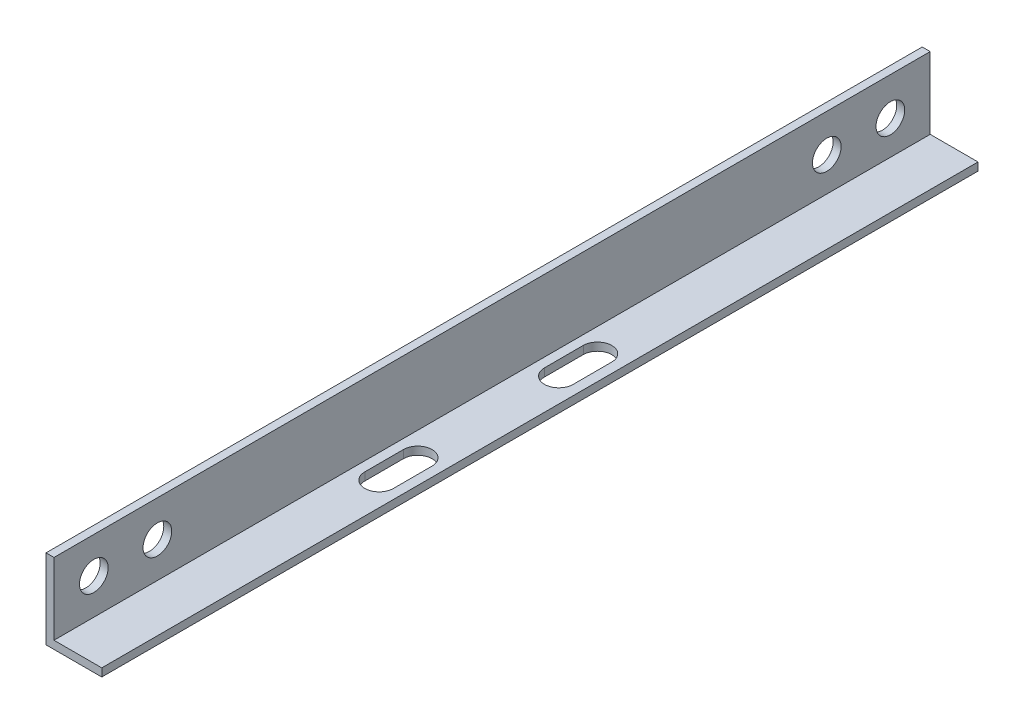
ISO-10303-21;
HEADER;
FILE_DESCRIPTION(('STEP AP214'),'2;1');
FILE_NAME('part.step','',(''),(''),'','','');
FILE_SCHEMA(('AUTOMOTIVE_DESIGN { 1 0 10303 214 1 1 1 1 }'));
ENDSEC;
DATA;
#1=APPLICATION_CONTEXT('core data for automotive mechanical design processes');
#2=APPLICATION_PROTOCOL_DEFINITION('international standard','automotive_design',2000,#1);
#3=PRODUCT_CONTEXT('',#1,'mechanical');
#4=PRODUCT('Part','Part','',(#3));
#5=PRODUCT_RELATED_PRODUCT_CATEGORY('part','',(#4));
#6=PRODUCT_DEFINITION_FORMATION('','',#4);
#7=PRODUCT_DEFINITION_CONTEXT('part definition',#1,'design');
#8=PRODUCT_DEFINITION('design','',#6,#7);
#9=PRODUCT_DEFINITION_SHAPE('','',#8);
#10=(LENGTH_UNIT() NAMED_UNIT(*) SI_UNIT(.MILLI.,.METRE.));
#11=(NAMED_UNIT(*) PLANE_ANGLE_UNIT() SI_UNIT($,.RADIAN.));
#12=(NAMED_UNIT(*) SI_UNIT($,.STERADIAN.) SOLID_ANGLE_UNIT());
#13=UNCERTAINTY_MEASURE_WITH_UNIT(LENGTH_MEASURE(1.E-05),#10,'distance_accuracy_value','');
#14=(GEOMETRIC_REPRESENTATION_CONTEXT(3) GLOBAL_UNCERTAINTY_ASSIGNED_CONTEXT((#13)) GLOBAL_UNIT_ASSIGNED_CONTEXT((#10,
#11,#12)) REPRESENTATION_CONTEXT('',''));
#15=CARTESIAN_POINT('',(0.,0.,0.));
#16=DIRECTION('',(0.,0.,1.));
#17=DIRECTION('',(1.,0.,0.));
#18=AXIS2_PLACEMENT_3D('',#15,#16,#17);
#19=CARTESIAN_POINT('',(-4.28571428571429,23.8095238095238,549.91));
#20=DIRECTION('',(0.,-1.,0.));
#21=DIRECTION('',(1.,0.,0.));
#22=AXIS2_PLACEMENT_3D('',#19,#20,#21);
#23=PLANE('',#22);
#24=DIRECTION('',(-1.,0.,0.));
#25=VECTOR('',#24,1.);
#26=CARTESIAN_POINT('',(-4.28571428571429,23.8095238095238,0.));
#27=LINE('',#26,#25);
#28=CARTESIAN_POINT('',(-4.28571428571429,23.8095238095238,0.));
#29=VERTEX_POINT('',#28);
#30=CARTESIAN_POINT('',(-9.28571428571429,23.8095238095238,0.));
#31=VERTEX_POINT('',#30);
#32=EDGE_CURVE('E227',#29,#31,#27,.T.);
#33=ORIENTED_EDGE('',*,*,#32,.T.);
#34=DIRECTION('',(0.,0.,-1.));
#35=VECTOR('',#34,1.);
#36=CARTESIAN_POINT('',(-9.28571428571429,23.8095238095238,549.91));
#37=LINE('',#36,#35);
#38=CARTESIAN_POINT('',(-9.28571428571429,23.8095238095238,549.91));
#39=VERTEX_POINT('',#38);
#40=EDGE_CURVE('E11',#39,#31,#37,.T.);
#41=ORIENTED_EDGE('',*,*,#40,.F.);
#42=DIRECTION('',(-1.,0.,0.));
#43=VECTOR('',#42,1.);
#44=CARTESIAN_POINT('',(-4.28571428571429,23.8095238095238,549.91));
#45=LINE('',#44,#43);
#46=CARTESIAN_POINT('',(-4.28571428571429,23.8095238095238,549.91));
#47=VERTEX_POINT('',#46);
#48=EDGE_CURVE('E228',#47,#39,#45,.T.);
#49=ORIENTED_EDGE('',*,*,#48,.F.);
#50=DIRECTION('',(0.,0.,-1.));
#51=VECTOR('',#50,1.);
#52=CARTESIAN_POINT('',(-4.28571428571429,23.8095238095238,549.91));
#53=LINE('',#52,#51);
#54=EDGE_CURVE('E242',#47,#29,#53,.T.);
#55=ORIENTED_EDGE('',*,*,#54,.T.);
#56=EDGE_LOOP('',(#33,#41,#49,#55));
#57=FACE_BOUND('',#56,.T.);
#58=ADVANCED_FACE('F33',(#57),#23,.F.);
#59=CARTESIAN_POINT('',(-9.28571428571429,23.8095238095238,549.91));
#60=DIRECTION('',(1.,0.,0.));
#61=DIRECTION('',(0.,1.,0.));
#62=AXIS2_PLACEMENT_3D('',#59,#60,#61);
#63=PLANE('',#62);
#64=CARTESIAN_POINT('',(-9.28571428571429,1.24999025814614,524.91));
#65=DIRECTION('',(1.,0.,0.));
#66=DIRECTION('',(0.,1.,0.));
#67=AXIS2_PLACEMENT_3D('',#64,#65,#66);
#68=CIRCLE('',#67,9.00000000000004);
#69=CARTESIAN_POINT('',(-9.28571428571429,10.2499902581462,524.91));
#70=VERTEX_POINT('',#69);
#71=EDGE_CURVE('E224',#70,#70,#68,.T.);
#72=ORIENTED_EDGE('',*,*,#71,.T.);
#73=EDGE_LOOP('',(#72));
#74=FACE_BOUND('',#73,.T.);
#75=CARTESIAN_POINT('',(-9.28571428571429,0.154572912796985,64.9099999999999));
#76=DIRECTION('',(1.,0.,0.));
#77=DIRECTION('',(0.,1.,0.));
#78=AXIS2_PLACEMENT_3D('',#75,#76,#77);
#79=CIRCLE('',#78,9.00000000000001);
#80=CARTESIAN_POINT('',(-9.28571428571429,9.154572912797,64.9099999999999));
#81=VERTEX_POINT('',#80);
#82=EDGE_CURVE('E221',#81,#81,#79,.T.);
#83=ORIENTED_EDGE('',*,*,#82,.T.);
#84=EDGE_LOOP('',(#83));
#85=FACE_BOUND('',#84,.T.);
#86=CARTESIAN_POINT('',(-9.28571428571429,0.0595335513776725,25.));
#87=DIRECTION('',(1.,0.,0.));
#88=DIRECTION('',(0.,1.,0.));
#89=AXIS2_PLACEMENT_3D('',#86,#87,#88);
#90=CIRCLE('',#89,9.);
#91=CARTESIAN_POINT('',(-9.28571428571429,9.05953355137768,25.));
#92=VERTEX_POINT('',#91);
#93=EDGE_CURVE('E218',#92,#92,#90,.T.);
#94=ORIENTED_EDGE('',*,*,#93,.T.);
#95=EDGE_LOOP('',(#94));
#96=FACE_BOUND('',#95,.T.);
#97=CARTESIAN_POINT('',(-9.28571428571429,1.15495089672683,485.));
#98=DIRECTION('',(1.,0.,0.));
#99=DIRECTION('',(0.,1.,0.));
#100=AXIS2_PLACEMENT_3D('',#97,#98,#99);
#101=CIRCLE('',#100,9.00000000000004);
#102=CARTESIAN_POINT('',(-9.28571428571429,10.1549508967269,485.));
#103=VERTEX_POINT('',#102);
#104=EDGE_CURVE('E207',#103,#103,#101,.T.);
#105=ORIENTED_EDGE('',*,*,#104,.T.);
#106=EDGE_LOOP('',(#105));
#107=FACE_BOUND('',#106,.T.);
#108=DIRECTION('',(0.,-1.,0.));
#109=VECTOR('',#108,1.);
#110=CARTESIAN_POINT('',(-9.28571428571429,23.8095238095238,0.));
#111=LINE('',#110,#109);
#112=CARTESIAN_POINT('',(-9.28571428571428,-26.1904761904762,0.));
#113=VERTEX_POINT('',#112);
#114=EDGE_CURVE('E245',#31,#113,#111,.T.);
#115=ORIENTED_EDGE('',*,*,#114,.T.);
#116=DIRECTION('',(0.,0.,-1.));
#117=VECTOR('',#116,1.);
#118=CARTESIAN_POINT('',(-9.28571428571428,-26.1904761904762,549.91));
#119=LINE('',#118,#117);
#120=CARTESIAN_POINT('',(-9.28571428571428,-26.1904761904762,549.91));
#121=VERTEX_POINT('',#120);
#122=EDGE_CURVE('E40',#121,#113,#119,.T.);
#123=ORIENTED_EDGE('',*,*,#122,.F.);
#124=DIRECTION('',(0.,-1.,0.));
#125=VECTOR('',#124,1.);
#126=CARTESIAN_POINT('',(-9.28571428571429,23.8095238095238,549.91));
#127=LINE('',#126,#125);
#128=EDGE_CURVE('E231',#39,#121,#127,.T.);
#129=ORIENTED_EDGE('',*,*,#128,.F.);
#130=ORIENTED_EDGE('',*,*,#40,.T.);
#131=EDGE_LOOP('',(#115,#123,#129,#130));
#132=FACE_BOUND('',#131,.T.);
#133=ADVANCED_FACE('F291',(#74,#85,#96,#107,#132),#63,.F.);
#134=CARTESIAN_POINT('',(-9.28571428571428,-26.1904761904762,549.91));
#135=DIRECTION('',(0.,1.,0.));
#136=DIRECTION('',(0.,0.,1.));
#137=AXIS2_PLACEMENT_3D('',#134,#135,#136);
#138=PLANE('',#137);
#139=DIRECTION('',(0.00147726711215062,0.,0.999998908840344));
#140=VECTOR('',#139,1.);
#141=CARTESIAN_POINT('',(2.01270960344723,-26.1904761904762,549.893309191757));
#142=LINE('',#141,#140);
#143=CARTESIAN_POINT('',(1.69741982703564,-26.1904761904762,336.465805264514));
#144=VERTEX_POINT('',#143);
#145=CARTESIAN_POINT('',(1.73349245595749,-26.1904761904762,360.884266397345));
#146=VERTEX_POINT('',#145);
#147=EDGE_CURVE('E197',#144,#146,#142,.T.);
#148=ORIENTED_EDGE('',*,*,#147,.T.);
#149=CARTESIAN_POINT('',(10.7334924559605,-26.1904761904762,360.884266397367));
#150=DIRECTION('',(0.,1.,0.));
#151=DIRECTION('',(0.,0.,1.));
#152=AXIS2_PLACEMENT_3D('',#149,#150,#151);
#153=CIRCLE('',#152,9.00000000000301);
#154=CARTESIAN_POINT('',(19.7334924559635,-26.1904761904762,360.884266397389));
#155=VERTEX_POINT('',#154);
#156=EDGE_CURVE('E200',#146,#155,#153,.T.);
#157=ORIENTED_EDGE('',*,*,#156,.T.);
#158=DIRECTION('',(-0.00157313090324563,0.,-0.999998762628815));
#159=VECTOR('',#158,1.);
#160=CARTESIAN_POINT('',(20.030782496039,-26.1904761904762,549.863881255872));
#161=LINE('',#160,#159);
#162=CARTESIAN_POINT('',(19.6950789726139,-26.1904761904762,336.465805264516));
#163=VERTEX_POINT('',#162);
#164=EDGE_CURVE('E194',#155,#163,#161,.T.);
#165=ORIENTED_EDGE('',*,*,#164,.T.);
#166=CARTESIAN_POINT('',(10.6962493998248,-26.1904761904762,336.610947676977));
#167=DIRECTION('',(0.,1.,0.));
#168=DIRECTION('',(0.,0.,1.));
#169=AXIS2_PLACEMENT_3D('',#166,#167,#168);
#170=CIRCLE('',#169,9.);
#171=EDGE_CURVE('E138',#163,#144,#170,.T.);
#172=ORIENTED_EDGE('',*,*,#171,.T.);
#173=EDGE_LOOP('',(#148,#157,#165,#172));
#174=FACE_BOUND('',#173,.T.);
#175=DIRECTION('',(0.00147726711215075,0.,0.999998908840344));
#176=VECTOR('',#175,1.);
#177=CARTESIAN_POINT('',(2.02856372277956,-26.1904761904762,549.893285770962));
#178=LINE('',#177,#176);
#179=CARTESIAN_POINT('',(1.54640073254233,-26.1904761904762,223.505146378587));
#180=VERTEX_POINT('',#179);
#181=CARTESIAN_POINT('',(1.58247336146419,-26.1904761904762,247.923607511418));
#182=VERTEX_POINT('',#181);
#183=EDGE_CURVE('E188',#180,#182,#178,.T.);
#184=ORIENTED_EDGE('',*,*,#183,.T.);
#185=CARTESIAN_POINT('',(10.5824733614642,-26.1904761904762,247.923607511435));
#186=DIRECTION('',(0.,1.,0.));
#187=DIRECTION('',(0.,0.,1.));
#188=AXIS2_PLACEMENT_3D('',#185,#186,#187);
#189=CIRCLE('',#188,9.);
#190=CARTESIAN_POINT('',(19.5824733614642,-26.1904761904762,247.923607511454));
#191=VERTEX_POINT('',#190);
#192=EDGE_CURVE('E191',#182,#191,#189,.T.);
#193=ORIENTED_EDGE('',*,*,#192,.T.);
#194=DIRECTION('',(-0.00157313090296661,0.,-0.999998762628815));
#195=VECTOR('',#194,1.);
#196=CARTESIAN_POINT('',(20.0574654586498,-26.1904761904762,549.863839280035));
#197=LINE('',#196,#195);
#198=CARTESIAN_POINT('',(19.5440598781214,-26.1904761904762,223.505146378588));
#199=VERTEX_POINT('',#198);
#200=EDGE_CURVE('E162',#191,#199,#197,.T.);
#201=ORIENTED_EDGE('',*,*,#200,.T.);
#202=CARTESIAN_POINT('',(10.5452303053319,-26.1904761904762,223.650288791024));
#203=DIRECTION('',(0.,1.,0.));
#204=DIRECTION('',(0.,0.,1.));
#205=AXIS2_PLACEMENT_3D('',#202,#203,#204);
#206=CIRCLE('',#205,9.);
#207=EDGE_CURVE('E185',#199,#180,#206,.T.);
#208=ORIENTED_EDGE('',*,*,#207,.T.);
#209=EDGE_LOOP('',(#184,#193,#201,#208));
#210=FACE_BOUND('',#209,.T.);
#211=DIRECTION('',(1.,0.,0.));
#212=VECTOR('',#211,1.);
#213=CARTESIAN_POINT('',(-9.28571428571428,-26.1904761904762,0.));
#214=LINE('',#213,#212);
#215=CARTESIAN_POINT('',(25.7142857142857,-26.1904761904762,0.));
#216=VERTEX_POINT('',#215);
#217=EDGE_CURVE('E247',#113,#216,#214,.T.);
#218=ORIENTED_EDGE('',*,*,#217,.T.);
#219=DIRECTION('',(0.,0.,-1.));
#220=VECTOR('',#219,1.);
#221=CARTESIAN_POINT('',(25.7142857142857,-26.1904761904762,549.91));
#222=LINE('',#221,#220);
#223=CARTESIAN_POINT('',(25.7142857142857,-26.1904761904762,549.91));
#224=VERTEX_POINT('',#223);
#225=EDGE_CURVE('E262',#224,#216,#222,.T.);
#226=ORIENTED_EDGE('',*,*,#225,.F.);
#227=DIRECTION('',(1.,0.,0.));
#228=VECTOR('',#227,1.);
#229=CARTESIAN_POINT('',(-9.28571428571428,-26.1904761904762,549.91));
#230=LINE('',#229,#228);
#231=EDGE_CURVE('E234',#121,#224,#230,.T.);
#232=ORIENTED_EDGE('',*,*,#231,.F.);
#233=ORIENTED_EDGE('',*,*,#122,.T.);
#234=EDGE_LOOP('',(#218,#226,#232,#233));
#235=FACE_BOUND('',#234,.T.);
#236=ADVANCED_FACE('F269',(#174,#210,#235),#138,.F.);
#237=CARTESIAN_POINT('',(25.7142857142857,-26.1904761904762,549.91));
#238=DIRECTION('',(-1.,0.,0.));
#239=DIRECTION('',(0.,0.,1.));
#240=AXIS2_PLACEMENT_3D('',#237,#238,#239);
#241=PLANE('',#240);
#242=DIRECTION('',(0.,1.,0.));
#243=VECTOR('',#242,1.);
#244=CARTESIAN_POINT('',(25.7142857142857,-26.1904761904762,0.));
#245=LINE('',#244,#243);
#246=CARTESIAN_POINT('',(25.7142857142857,-21.1904761904762,0.));
#247=VERTEX_POINT('',#246);
#248=EDGE_CURVE('E249',#216,#247,#245,.T.);
#249=ORIENTED_EDGE('',*,*,#248,.T.);
#250=DIRECTION('',(0.,0.,-1.));
#251=VECTOR('',#250,1.);
#252=CARTESIAN_POINT('',(25.7142857142857,-21.1904761904762,549.91));
#253=LINE('',#252,#251);
#254=CARTESIAN_POINT('',(25.7142857142857,-21.1904761904762,549.91));
#255=VERTEX_POINT('',#254);
#256=EDGE_CURVE('E259',#255,#247,#253,.T.);
#257=ORIENTED_EDGE('',*,*,#256,.F.);
#258=DIRECTION('',(0.,1.,0.));
#259=VECTOR('',#258,1.);
#260=CARTESIAN_POINT('',(25.7142857142857,-26.1904761904762,549.91));
#261=LINE('',#260,#259);
#262=EDGE_CURVE('E236',#224,#255,#261,.T.);
#263=ORIENTED_EDGE('',*,*,#262,.F.);
#264=ORIENTED_EDGE('',*,*,#225,.T.);
#265=EDGE_LOOP('',(#249,#257,#263,#264));
#266=FACE_BOUND('',#265,.T.);
#267=ADVANCED_FACE('F280',(#266),#241,.F.);
#268=CARTESIAN_POINT('',(25.7142857142857,-21.1904761904762,549.91));
#269=DIRECTION('',(0.,-1.,0.));
#270=DIRECTION('',(0.,0.,-1.));
#271=AXIS2_PLACEMENT_3D('',#268,#269,#270);
#272=PLANE('',#271);
#273=DIRECTION('',(-0.00157313090324563,0.,-0.999998762628815));
#274=VECTOR('',#273,1.);
#275=CARTESIAN_POINT('',(19.7334924559635,-21.1904761904762,360.884266397389));
#276=LINE('',#275,#274);
#277=CARTESIAN_POINT('',(19.7334924559635,-21.1904761904762,360.884266397389));
#278=VERTEX_POINT('',#277);
#279=CARTESIAN_POINT('',(19.695078972614,-21.1904761904762,336.465805264516));
#280=VERTEX_POINT('',#279);
#281=EDGE_CURVE('E145',#278,#280,#276,.T.);
#282=ORIENTED_EDGE('',*,*,#281,.F.);
#283=CARTESIAN_POINT('',(10.7334924559605,-21.1904761904762,360.884266397367));
#284=DIRECTION('',(0.,1.,0.));
#285=DIRECTION('',(0.,0.,1.));
#286=AXIS2_PLACEMENT_3D('',#283,#284,#285);
#287=CIRCLE('',#286,9.00000000000301);
#288=CARTESIAN_POINT('',(1.73349245595749,-21.1904761904762,360.884266397345));
#289=VERTEX_POINT('',#288);
#290=EDGE_CURVE('E150',#289,#278,#287,.T.);
#291=ORIENTED_EDGE('',*,*,#290,.F.);
#292=DIRECTION('',(0.00147726711215062,0.,0.999998908840344));
#293=VECTOR('',#292,1.);
#294=CARTESIAN_POINT('',(1.73349245595749,-21.1904761904762,360.884266397345));
#295=LINE('',#294,#293);
#296=CARTESIAN_POINT('',(1.69741982703564,-21.1904761904762,336.465805264514));
#297=VERTEX_POINT('',#296);
#298=EDGE_CURVE('E155',#297,#289,#295,.T.);
#299=ORIENTED_EDGE('',*,*,#298,.F.);
#300=CARTESIAN_POINT('',(10.6962493998248,-21.1904761904762,336.610947676977));
#301=DIRECTION('',(0.,1.,0.));
#302=DIRECTION('',(0.,0.,-1.));
#303=AXIS2_PLACEMENT_3D('',#300,#301,#302);
#304=CIRCLE('',#303,9.);
#305=EDGE_CURVE('E135',#280,#297,#304,.T.);
#306=ORIENTED_EDGE('',*,*,#305,.F.);
#307=EDGE_LOOP('',(#282,#291,#299,#306));
#308=FACE_BOUND('',#307,.T.);
#309=DIRECTION('',(-0.00157313090296661,0.,-0.999998762628815));
#310=VECTOR('',#309,1.);
#311=CARTESIAN_POINT('',(19.5824733614642,-21.1904761904762,247.923607511454));
#312=LINE('',#311,#310);
#313=CARTESIAN_POINT('',(19.5824733614642,-21.1904761904762,247.923607511454));
#314=VERTEX_POINT('',#313);
#315=CARTESIAN_POINT('',(19.5440598781215,-21.1904761904762,223.505146378588));
#316=VERTEX_POINT('',#315);
#317=EDGE_CURVE('E167',#314,#316,#312,.T.);
#318=ORIENTED_EDGE('',*,*,#317,.F.);
#319=CARTESIAN_POINT('',(10.5824733614642,-21.1904761904762,247.923607511435));
#320=DIRECTION('',(0.,1.,0.));
#321=DIRECTION('',(0.,0.,1.));
#322=AXIS2_PLACEMENT_3D('',#319,#320,#321);
#323=CIRCLE('',#322,9.);
#324=CARTESIAN_POINT('',(1.58247336146419,-21.1904761904762,247.923607511418));
#325=VERTEX_POINT('',#324);
#326=EDGE_CURVE('E165',#325,#314,#323,.T.);
#327=ORIENTED_EDGE('',*,*,#326,.F.);
#328=DIRECTION('',(0.00147726711215075,0.,0.999998908840344));
#329=VECTOR('',#328,1.);
#330=CARTESIAN_POINT('',(1.58247336146419,-21.1904761904762,247.923607511418));
#331=LINE('',#330,#329);
#332=CARTESIAN_POINT('',(1.54640073254233,-21.1904761904762,223.505146378587));
#333=VERTEX_POINT('',#332);
#334=EDGE_CURVE('E172',#333,#325,#331,.T.);
#335=ORIENTED_EDGE('',*,*,#334,.F.);
#336=CARTESIAN_POINT('',(10.5452303053319,-21.1904761904762,223.650288791024));
#337=DIRECTION('',(0.,1.,0.));
#338=DIRECTION('',(0.,0.,-1.));
#339=AXIS2_PLACEMENT_3D('',#336,#337,#338);
#340=CIRCLE('',#339,9.);
#341=EDGE_CURVE('E169',#316,#333,#340,.T.);
#342=ORIENTED_EDGE('',*,*,#341,.F.);
#343=EDGE_LOOP('',(#318,#327,#335,#342));
#344=FACE_BOUND('',#343,.T.);
#345=DIRECTION('',(-1.,0.,0.));
#346=VECTOR('',#345,1.);
#347=CARTESIAN_POINT('',(25.7142857142857,-21.1904761904762,0.));
#348=LINE('',#347,#346);
#349=CARTESIAN_POINT('',(-4.28571428571429,-21.1904761904762,0.));
#350=VERTEX_POINT('',#349);
#351=EDGE_CURVE('E251',#247,#350,#348,.T.);
#352=ORIENTED_EDGE('',*,*,#351,.T.);
#353=DIRECTION('',(0.,0.,-1.));
#354=VECTOR('',#353,1.);
#355=CARTESIAN_POINT('',(-4.28571428571429,-21.1904761904762,549.91));
#356=LINE('',#355,#354);
#357=CARTESIAN_POINT('',(-4.28571428571429,-21.1904761904762,549.91));
#358=VERTEX_POINT('',#357);
#359=EDGE_CURVE('E256',#358,#350,#356,.T.);
#360=ORIENTED_EDGE('',*,*,#359,.F.);
#361=DIRECTION('',(-1.,0.,0.));
#362=VECTOR('',#361,1.);
#363=CARTESIAN_POINT('',(25.7142857142857,-21.1904761904762,549.91));
#364=LINE('',#363,#362);
#365=EDGE_CURVE('E238',#255,#358,#364,.T.);
#366=ORIENTED_EDGE('',*,*,#365,.F.);
#367=ORIENTED_EDGE('',*,*,#256,.T.);
#368=EDGE_LOOP('',(#352,#360,#366,#367));
#369=FACE_BOUND('',#368,.T.);
#370=ADVANCED_FACE('F152',(#308,#344,#369),#272,.F.);
#371=CARTESIAN_POINT('',(-4.28571428571429,-21.1904761904762,549.91));
#372=DIRECTION('',(-1.,0.,0.));
#373=DIRECTION('',(0.,-1.,0.));
#374=AXIS2_PLACEMENT_3D('',#371,#372,#373);
#375=PLANE('',#374);
#376=CARTESIAN_POINT('',(-4.28571428571429,1.24999025814614,524.91));
#377=DIRECTION('',(1.,0.,0.));
#378=DIRECTION('',(0.,1.,0.));
#379=AXIS2_PLACEMENT_3D('',#376,#377,#378);
#380=CIRCLE('',#379,9.00000000000004);
#381=CARTESIAN_POINT('',(-4.28571428571429,10.2499902581462,524.91));
#382=VERTEX_POINT('',#381);
#383=EDGE_CURVE('E204',#382,#382,#380,.T.);
#384=ORIENTED_EDGE('',*,*,#383,.F.);
#385=EDGE_LOOP('',(#384));
#386=FACE_BOUND('',#385,.T.);
#387=CARTESIAN_POINT('',(-4.28571428571429,0.154572912796986,64.9099999999999));
#388=DIRECTION('',(1.,0.,0.));
#389=DIRECTION('',(0.,1.,0.));
#390=AXIS2_PLACEMENT_3D('',#387,#388,#389);
#391=CIRCLE('',#390,9.00000000000001);
#392=CARTESIAN_POINT('',(-4.28571428571429,9.154572912797,64.9099999999999));
#393=VERTEX_POINT('',#392);
#394=EDGE_CURVE('E203',#393,#393,#391,.T.);
#395=ORIENTED_EDGE('',*,*,#394,.F.);
#396=EDGE_LOOP('',(#395));
#397=FACE_BOUND('',#396,.T.);
#398=CARTESIAN_POINT('',(-4.28571428571429,0.0595335513776729,25.));
#399=DIRECTION('',(1.,0.,0.));
#400=DIRECTION('',(0.,1.,0.));
#401=AXIS2_PLACEMENT_3D('',#398,#399,#400);
#402=CIRCLE('',#401,9.);
#403=CARTESIAN_POINT('',(-4.28571428571429,9.05953355137768,25.));
#404=VERTEX_POINT('',#403);
#405=EDGE_CURVE('E211',#404,#404,#402,.T.);
#406=ORIENTED_EDGE('',*,*,#405,.F.);
#407=EDGE_LOOP('',(#406));
#408=FACE_BOUND('',#407,.T.);
#409=CARTESIAN_POINT('',(-4.28571428571429,1.15495089672683,485.));
#410=DIRECTION('',(1.,0.,0.));
#411=DIRECTION('',(0.,1.,0.));
#412=AXIS2_PLACEMENT_3D('',#409,#410,#411);
#413=CIRCLE('',#412,9.00000000000004);
#414=CARTESIAN_POINT('',(-4.28571428571429,10.1549508967269,485.));
#415=VERTEX_POINT('',#414);
#416=EDGE_CURVE('E208',#415,#415,#413,.T.);
#417=ORIENTED_EDGE('',*,*,#416,.F.);
#418=EDGE_LOOP('',(#417));
#419=FACE_BOUND('',#418,.T.);
#420=DIRECTION('',(0.,1.,0.));
#421=VECTOR('',#420,1.);
#422=CARTESIAN_POINT('',(-4.28571428571429,-21.1904761904762,0.));
#423=LINE('',#422,#421);
#424=EDGE_CURVE('E232',#350,#29,#423,.T.);
#425=ORIENTED_EDGE('',*,*,#424,.T.);
#426=ORIENTED_EDGE('',*,*,#54,.F.);
#427=DIRECTION('',(0.,1.,0.));
#428=VECTOR('',#427,1.);
#429=CARTESIAN_POINT('',(-4.28571428571429,-21.1904761904762,549.91));
#430=LINE('',#429,#428);
#431=EDGE_CURVE('E240',#358,#47,#430,.T.);
#432=ORIENTED_EDGE('',*,*,#431,.F.);
#433=ORIENTED_EDGE('',*,*,#359,.T.);
#434=EDGE_LOOP('',(#425,#426,#432,#433));
#435=FACE_BOUND('',#434,.T.);
#436=ADVANCED_FACE('F294',(#386,#397,#408,#419,#435),#375,.F.);
#437=CARTESIAN_POINT('',(0.,0.,549.91));
#438=DIRECTION('',(0.,0.,1.));
#439=DIRECTION('',(1.,0.,0.));
#440=AXIS2_PLACEMENT_3D('',#437,#438,#439);
#441=PLANE('',#440);
#442=ORIENTED_EDGE('',*,*,#48,.T.);
#443=ORIENTED_EDGE('',*,*,#128,.T.);
#444=ORIENTED_EDGE('',*,*,#231,.T.);
#445=ORIENTED_EDGE('',*,*,#262,.T.);
#446=ORIENTED_EDGE('',*,*,#365,.T.);
#447=ORIENTED_EDGE('',*,*,#431,.T.);
#448=EDGE_LOOP('',(#442,#443,#444,#445,#446,#447));
#449=FACE_BOUND('',#448,.T.);
#450=ADVANCED_FACE('F287',(#449),#441,.T.);
#451=CARTESIAN_POINT('',(0.,0.,0.));
#452=DIRECTION('',(0.,0.,1.));
#453=DIRECTION('',(1.,0.,0.));
#454=AXIS2_PLACEMENT_3D('',#451,#452,#453);
#455=PLANE('',#454);
#456=ORIENTED_EDGE('',*,*,#32,.F.);
#457=ORIENTED_EDGE('',*,*,#424,.F.);
#458=ORIENTED_EDGE('',*,*,#351,.F.);
#459=ORIENTED_EDGE('',*,*,#248,.F.);
#460=ORIENTED_EDGE('',*,*,#217,.F.);
#461=ORIENTED_EDGE('',*,*,#114,.F.);
#462=EDGE_LOOP('',(#456,#457,#458,#459,#460,#461));
#463=FACE_BOUND('',#462,.T.);
#464=ADVANCED_FACE('F275',(#463),#455,.F.);
#465=CARTESIAN_POINT('',(-14.2857142857143,1.15495089672683,485.));
#466=DIRECTION('',(1.,0.,0.));
#467=DIRECTION('',(0.,1.,0.));
#468=AXIS2_PLACEMENT_3D('',#465,#466,#467);
#469=CYLINDRICAL_SURFACE('',#468,9.00000000000004);
#470=ORIENTED_EDGE('',*,*,#416,.T.);
#471=EDGE_LOOP('',(#470));
#472=FACE_BOUND('',#471,.T.);
#473=ORIENTED_EDGE('',*,*,#104,.F.);
#474=EDGE_LOOP('',(#473));
#475=FACE_BOUND('',#474,.T.);
#476=ADVANCED_FACE('F423',(#472,#475),#469,.F.);
#477=CARTESIAN_POINT('',(-14.2857142857143,0.0595335513776721,25.));
#478=DIRECTION('',(1.,0.,0.));
#479=DIRECTION('',(0.,1.,0.));
#480=AXIS2_PLACEMENT_3D('',#477,#478,#479);
#481=CYLINDRICAL_SURFACE('',#480,9.);
#482=ORIENTED_EDGE('',*,*,#405,.T.);
#483=EDGE_LOOP('',(#482));
#484=FACE_BOUND('',#483,.T.);
#485=ORIENTED_EDGE('',*,*,#93,.F.);
#486=EDGE_LOOP('',(#485));
#487=FACE_BOUND('',#486,.T.);
#488=ADVANCED_FACE('F421',(#484,#487),#481,.F.);
#489=CARTESIAN_POINT('',(-14.2857142857143,0.154572912796985,64.9099999999999));
#490=DIRECTION('',(1.,0.,0.));
#491=DIRECTION('',(0.,1.,0.));
#492=AXIS2_PLACEMENT_3D('',#489,#490,#491);
#493=CYLINDRICAL_SURFACE('',#492,9.00000000000001);
#494=ORIENTED_EDGE('',*,*,#394,.T.);
#495=EDGE_LOOP('',(#494));
#496=FACE_BOUND('',#495,.T.);
#497=ORIENTED_EDGE('',*,*,#82,.F.);
#498=EDGE_LOOP('',(#497));
#499=FACE_BOUND('',#498,.T.);
#500=ADVANCED_FACE('F417',(#496,#499),#493,.F.);
#501=CARTESIAN_POINT('',(-14.2857142857143,1.24999025814614,524.91));
#502=DIRECTION('',(1.,0.,0.));
#503=DIRECTION('',(0.,1.,0.));
#504=AXIS2_PLACEMENT_3D('',#501,#502,#503);
#505=CYLINDRICAL_SURFACE('',#504,9.00000000000004);
#506=ORIENTED_EDGE('',*,*,#383,.T.);
#507=EDGE_LOOP('',(#506));
#508=FACE_BOUND('',#507,.T.);
#509=ORIENTED_EDGE('',*,*,#71,.F.);
#510=EDGE_LOOP('',(#509));
#511=FACE_BOUND('',#510,.T.);
#512=ADVANCED_FACE('F344',(#508,#511),#505,.F.);
#513=CARTESIAN_POINT('',(10.5824733614642,-31.1904761904762,247.923607511435));
#514=DIRECTION('',(0.,1.,0.));
#515=DIRECTION('',(0.,0.,1.));
#516=AXIS2_PLACEMENT_3D('',#513,#514,#515);
#517=CYLINDRICAL_SURFACE('',#516,9.);
#518=DIRECTION('',(0.,1.,0.));
#519=VECTOR('',#518,1.);
#520=CARTESIAN_POINT('',(1.58247336146419,-31.1904761904762,247.923607511418));
#521=LINE('',#520,#519);
#522=EDGE_CURVE('E176',#182,#325,#521,.T.);
#523=ORIENTED_EDGE('',*,*,#522,.T.);
#524=ORIENTED_EDGE('',*,*,#326,.T.);
#525=DIRECTION('',(0.,1.,0.));
#526=VECTOR('',#525,1.);
#527=CARTESIAN_POINT('',(19.5824733614642,-31.1904761904762,247.923607511454));
#528=LINE('',#527,#526);
#529=EDGE_CURVE('E175',#191,#314,#528,.T.);
#530=ORIENTED_EDGE('',*,*,#529,.F.);
#531=ORIENTED_EDGE('',*,*,#192,.F.);
#532=EDGE_LOOP('',(#523,#524,#530,#531));
#533=FACE_BOUND('',#532,.T.);
#534=ADVANCED_FACE('F338',(#533),#517,.F.);
#535=CARTESIAN_POINT('',(1.58247336146419,-31.1904761904762,247.923607511418));
#536=DIRECTION('',(-0.999998908840344,0.,0.00147726711215075));
#537=DIRECTION('',(0.00147726711215075,0.,0.999998908840344));
#538=AXIS2_PLACEMENT_3D('',#535,#536,#537);
#539=PLANE('',#538);
#540=DIRECTION('',(0.,1.,0.));
#541=VECTOR('',#540,1.);
#542=CARTESIAN_POINT('',(1.54640073254233,-31.1904761904762,223.505146378587));
#543=LINE('',#542,#541);
#544=EDGE_CURVE('E178',#180,#333,#543,.T.);
#545=ORIENTED_EDGE('',*,*,#544,.T.);
#546=ORIENTED_EDGE('',*,*,#334,.T.);
#547=ORIENTED_EDGE('',*,*,#522,.F.);
#548=ORIENTED_EDGE('',*,*,#183,.F.);
#549=EDGE_LOOP('',(#545,#546,#547,#548));
#550=FACE_BOUND('',#549,.T.);
#551=ADVANCED_FACE('F343',(#550),#539,.F.);
#552=CARTESIAN_POINT('',(10.5452303053319,-31.1904761904762,223.650288791024));
#553=DIRECTION('',(0.,1.,0.));
#554=DIRECTION('',(0.,0.,1.));
#555=AXIS2_PLACEMENT_3D('',#552,#553,#554);
#556=CYLINDRICAL_SURFACE('',#555,9.);
#557=DIRECTION('',(0.,1.,0.));
#558=VECTOR('',#557,1.);
#559=CARTESIAN_POINT('',(19.5440598781215,-31.1904761904762,223.505146378588));
#560=LINE('',#559,#558);
#561=EDGE_CURVE('E55',#199,#316,#560,.T.);
#562=ORIENTED_EDGE('',*,*,#561,.T.);
#563=ORIENTED_EDGE('',*,*,#341,.T.);
#564=ORIENTED_EDGE('',*,*,#544,.F.);
#565=ORIENTED_EDGE('',*,*,#207,.F.);
#566=EDGE_LOOP('',(#562,#563,#564,#565));
#567=FACE_BOUND('',#566,.T.);
#568=ADVANCED_FACE('F356',(#567),#556,.F.);
#569=CARTESIAN_POINT('',(19.5824733614642,-31.1904761904762,247.923607511454));
#570=DIRECTION('',(0.999998762628815,0.,-0.00157313090296661));
#571=DIRECTION('',(-0.00157313090296661,0.,-0.999998762628815));
#572=AXIS2_PLACEMENT_3D('',#569,#570,#571);
#573=PLANE('',#572);
#574=ORIENTED_EDGE('',*,*,#529,.T.);
#575=ORIENTED_EDGE('',*,*,#317,.T.);
#576=ORIENTED_EDGE('',*,*,#561,.F.);
#577=ORIENTED_EDGE('',*,*,#200,.F.);
#578=EDGE_LOOP('',(#574,#575,#576,#577));
#579=FACE_BOUND('',#578,.T.);
#580=ADVANCED_FACE('F366',(#579),#573,.F.);
#581=CARTESIAN_POINT('',(10.7334924559605,-31.1904761904762,360.884266397367));
#582=DIRECTION('',(0.,1.,0.));
#583=DIRECTION('',(0.,0.,1.));
#584=AXIS2_PLACEMENT_3D('',#581,#582,#583);
#585=CYLINDRICAL_SURFACE('',#584,9.00000000000301);
#586=DIRECTION('',(0.,1.,0.));
#587=VECTOR('',#586,1.);
#588=CARTESIAN_POINT('',(1.73349245595749,-31.1904761904762,360.884266397345));
#589=LINE('',#588,#587);
#590=EDGE_CURVE('E160',#146,#289,#589,.T.);
#591=ORIENTED_EDGE('',*,*,#590,.T.);
#592=ORIENTED_EDGE('',*,*,#290,.T.);
#593=DIRECTION('',(0.,1.,0.));
#594=VECTOR('',#593,1.);
#595=CARTESIAN_POINT('',(19.7334924559635,-31.1904761904762,360.884266397389));
#596=LINE('',#595,#594);
#597=EDGE_CURVE('E141',#155,#278,#596,.T.);
#598=ORIENTED_EDGE('',*,*,#597,.F.);
#599=ORIENTED_EDGE('',*,*,#156,.F.);
#600=EDGE_LOOP('',(#591,#592,#598,#599));
#601=FACE_BOUND('',#600,.T.);
#602=ADVANCED_FACE('F376',(#601),#585,.F.);
#603=CARTESIAN_POINT('',(1.73349245595749,-31.1904761904762,360.884266397345));
#604=DIRECTION('',(-0.999998908840344,0.,0.00147726711215062));
#605=DIRECTION('',(0.00147726711215062,0.,0.999998908840344));
#606=AXIS2_PLACEMENT_3D('',#603,#604,#605);
#607=PLANE('',#606);
#608=DIRECTION('',(0.,1.,0.));
#609=VECTOR('',#608,1.);
#610=CARTESIAN_POINT('',(1.69741982703564,-31.1904761904762,336.465805264514));
#611=LINE('',#610,#609);
#612=EDGE_CURVE('E140',#144,#297,#611,.T.);
#613=ORIENTED_EDGE('',*,*,#612,.T.);
#614=ORIENTED_EDGE('',*,*,#298,.T.);
#615=ORIENTED_EDGE('',*,*,#590,.F.);
#616=ORIENTED_EDGE('',*,*,#147,.F.);
#617=EDGE_LOOP('',(#613,#614,#615,#616));
#618=FACE_BOUND('',#617,.T.);
#619=ADVANCED_FACE('F385',(#618),#607,.F.);
#620=CARTESIAN_POINT('',(10.6962493998248,-31.1904761904762,336.610947676977));
#621=DIRECTION('',(0.,1.,0.));
#622=DIRECTION('',(0.,0.,1.));
#623=AXIS2_PLACEMENT_3D('',#620,#621,#622);
#624=CYLINDRICAL_SURFACE('',#623,9.);
#625=DIRECTION('',(0.,1.,0.));
#626=VECTOR('',#625,1.);
#627=CARTESIAN_POINT('',(19.695078972614,-31.1904761904762,336.465805264516));
#628=LINE('',#627,#626);
#629=EDGE_CURVE('E47',#163,#280,#628,.T.);
#630=ORIENTED_EDGE('',*,*,#629,.T.);
#631=ORIENTED_EDGE('',*,*,#305,.T.);
#632=ORIENTED_EDGE('',*,*,#612,.F.);
#633=ORIENTED_EDGE('',*,*,#171,.F.);
#634=EDGE_LOOP('',(#630,#631,#632,#633));
#635=FACE_BOUND('',#634,.T.);
#636=ADVANCED_FACE('F132',(#635),#624,.F.);
#637=CARTESIAN_POINT('',(19.7334924559635,-31.1904761904762,360.884266397389));
#638=DIRECTION('',(0.999998762628815,0.,-0.00157313090324563));
#639=DIRECTION('',(-0.00157313090324563,0.,-0.999998762628815));
#640=AXIS2_PLACEMENT_3D('',#637,#638,#639);
#641=PLANE('',#640);
#642=ORIENTED_EDGE('',*,*,#597,.T.);
#643=ORIENTED_EDGE('',*,*,#281,.T.);
#644=ORIENTED_EDGE('',*,*,#629,.F.);
#645=ORIENTED_EDGE('',*,*,#164,.F.);
#646=EDGE_LOOP('',(#642,#643,#644,#645));
#647=FACE_BOUND('',#646,.T.);
#648=ADVANCED_FACE('F146',(#647),#641,.F.);
#649=CLOSED_SHELL('',(#58,#133,#236,#267,#370,#436,#450,#464,#476,#488,#500,#512,#534,#551,#568,
#580,#602,#619,#636,#648));
#650=MANIFOLD_SOLID_BREP('B2',#649);
#651=ADVANCED_BREP_SHAPE_REPRESENTATION('',(#18,#650),#14);
#652=SHAPE_DEFINITION_REPRESENTATION(#9,#651);
ENDSEC;
END-ISO-10303-21;
